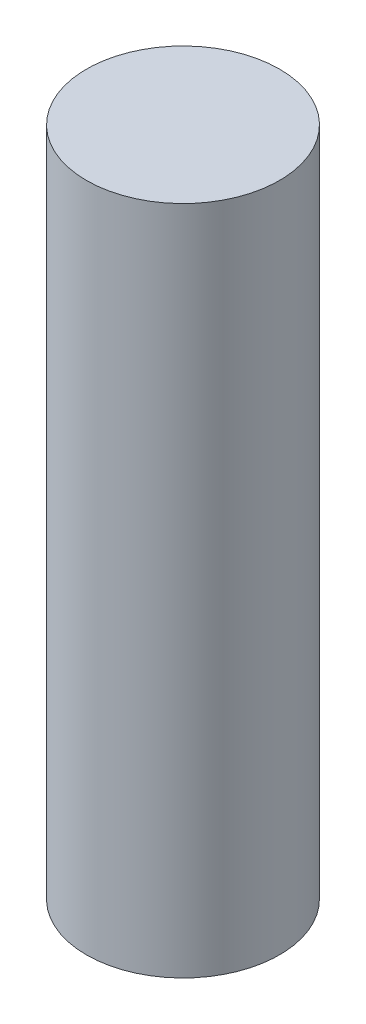
ISO-10303-21;
HEADER;
FILE_DESCRIPTION(('STEP AP214'),'2;1');
FILE_NAME('part.step','',(''),(''),'','','');
FILE_SCHEMA(('AUTOMOTIVE_DESIGN { 1 0 10303 214 1 1 1 1 }'));
ENDSEC;
DATA;
#1=APPLICATION_CONTEXT('core data for automotive mechanical design processes');
#2=APPLICATION_PROTOCOL_DEFINITION('international standard','automotive_design',2000,#1);
#3=PRODUCT_CONTEXT('',#1,'mechanical');
#4=PRODUCT('Part','Part','',(#3));
#5=PRODUCT_RELATED_PRODUCT_CATEGORY('part','',(#4));
#6=PRODUCT_DEFINITION_FORMATION('','',#4);
#7=PRODUCT_DEFINITION_CONTEXT('part definition',#1,'design');
#8=PRODUCT_DEFINITION('design','',#6,#7);
#9=PRODUCT_DEFINITION_SHAPE('','',#8);
#10=(LENGTH_UNIT() NAMED_UNIT(*) SI_UNIT(.MILLI.,.METRE.));
#11=(NAMED_UNIT(*) PLANE_ANGLE_UNIT() SI_UNIT($,.RADIAN.));
#12=(NAMED_UNIT(*) SI_UNIT($,.STERADIAN.) SOLID_ANGLE_UNIT());
#13=UNCERTAINTY_MEASURE_WITH_UNIT(LENGTH_MEASURE(1.E-05),#10,'distance_accuracy_value','');
#14=(GEOMETRIC_REPRESENTATION_CONTEXT(3) GLOBAL_UNCERTAINTY_ASSIGNED_CONTEXT((#13)) GLOBAL_UNIT_ASSIGNED_CONTEXT((#10,
#11,#12)) REPRESENTATION_CONTEXT('',''));
#15=CARTESIAN_POINT('',(0.,0.,0.));
#16=DIRECTION('',(0.,0.,1.));
#17=DIRECTION('',(1.,0.,0.));
#18=AXIS2_PLACEMENT_3D('',#15,#16,#17);
#19=CARTESIAN_POINT('',(0.,20.5,0.));
#20=DIRECTION('',(0.,-1.,0.));
#21=DIRECTION('',(0.,0.,-1.));
#22=AXIS2_PLACEMENT_3D('',#19,#20,#21);
#23=CYLINDRICAL_SURFACE('',#22,2.95);
#24=CARTESIAN_POINT('',(0.,20.5,0.));
#25=DIRECTION('',(0.,1.,0.));
#26=DIRECTION('',(0.,0.,1.));
#27=AXIS2_PLACEMENT_3D('',#24,#25,#26);
#28=CIRCLE('',#27,2.95);
#29=CARTESIAN_POINT('',(0.,20.5,2.95));
#30=VERTEX_POINT('',#29);
#31=EDGE_CURVE('E10',#30,#30,#28,.T.);
#32=ORIENTED_EDGE('',*,*,#31,.F.);
#33=EDGE_LOOP('',(#32));
#34=FACE_BOUND('',#33,.T.);
#35=CARTESIAN_POINT('',(0.,0.,0.));
#36=DIRECTION('',(0.,1.,0.));
#37=DIRECTION('',(0.,0.,1.));
#38=AXIS2_PLACEMENT_3D('',#35,#36,#37);
#39=CIRCLE('',#38,2.95);
#40=CARTESIAN_POINT('',(0.,0.,2.95));
#41=VERTEX_POINT('',#40);
#42=EDGE_CURVE('E33',#41,#41,#39,.T.);
#43=ORIENTED_EDGE('',*,*,#42,.T.);
#44=EDGE_LOOP('',(#43));
#45=FACE_BOUND('',#44,.T.);
#46=ADVANCED_FACE('F30',(#34,#45),#23,.T.);
#47=CARTESIAN_POINT('',(0.,20.5,0.));
#48=DIRECTION('',(0.,1.,0.));
#49=DIRECTION('',(0.,0.,1.));
#50=AXIS2_PLACEMENT_3D('',#47,#48,#49);
#51=PLANE('',#50);
#52=ORIENTED_EDGE('',*,*,#31,.T.);
#53=EDGE_LOOP('',(#52));
#54=FACE_BOUND('',#53,.T.);
#55=ADVANCED_FACE('F45',(#54),#51,.T.);
#56=CARTESIAN_POINT('',(0.,0.,0.));
#57=DIRECTION('',(0.,1.,0.));
#58=DIRECTION('',(0.,0.,1.));
#59=AXIS2_PLACEMENT_3D('',#56,#57,#58);
#60=PLANE('',#59);
#61=ORIENTED_EDGE('',*,*,#42,.F.);
#62=EDGE_LOOP('',(#61));
#63=FACE_BOUND('',#62,.T.);
#64=ADVANCED_FACE('F43',(#63),#60,.F.);
#65=CLOSED_SHELL('',(#46,#55,#64));
#66=MANIFOLD_SOLID_BREP('B2',#65);
#67=ADVANCED_BREP_SHAPE_REPRESENTATION('',(#18,#66),#14);
#68=SHAPE_DEFINITION_REPRESENTATION(#9,#67);
ENDSEC;
END-ISO-10303-21;
